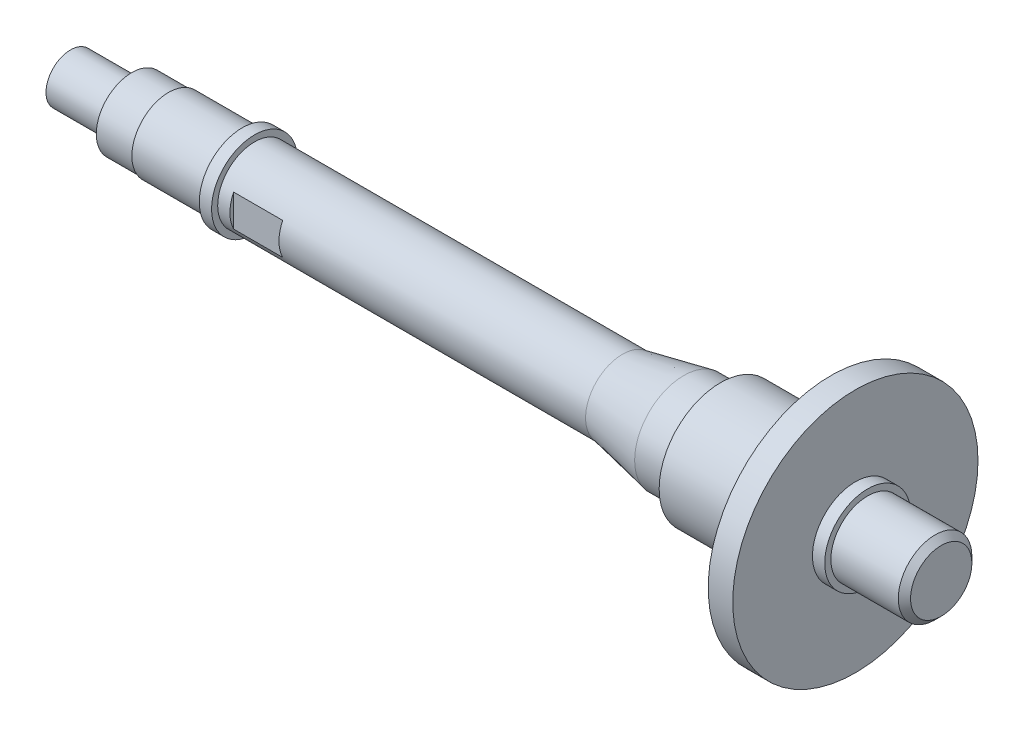
ISO-10303-21;
HEADER;
FILE_DESCRIPTION(('STEP AP214'),'2;1');
FILE_NAME('part.step','',(''),(''),'','','');
FILE_SCHEMA(('AUTOMOTIVE_DESIGN { 1 0 10303 214 1 1 1 1 }'));
ENDSEC;
DATA;
#1=APPLICATION_CONTEXT('core data for automotive mechanical design processes');
#2=APPLICATION_PROTOCOL_DEFINITION('international standard','automotive_design',2000,#1);
#3=PRODUCT_CONTEXT('',#1,'mechanical');
#4=PRODUCT('Part','Part','',(#3));
#5=PRODUCT_RELATED_PRODUCT_CATEGORY('part','',(#4));
#6=PRODUCT_DEFINITION_FORMATION('','',#4);
#7=PRODUCT_DEFINITION_CONTEXT('part definition',#1,'design');
#8=PRODUCT_DEFINITION('design','',#6,#7);
#9=PRODUCT_DEFINITION_SHAPE('','',#8);
#10=(LENGTH_UNIT() NAMED_UNIT(*) SI_UNIT(.MILLI.,.METRE.));
#11=(NAMED_UNIT(*) PLANE_ANGLE_UNIT() SI_UNIT($,.RADIAN.));
#12=(NAMED_UNIT(*) SI_UNIT($,.STERADIAN.) SOLID_ANGLE_UNIT());
#13=UNCERTAINTY_MEASURE_WITH_UNIT(LENGTH_MEASURE(1.E-05),#10,'distance_accuracy_value','');
#14=(GEOMETRIC_REPRESENTATION_CONTEXT(3) GLOBAL_UNCERTAINTY_ASSIGNED_CONTEXT((#13)) GLOBAL_UNIT_ASSIGNED_CONTEXT((#10,
#11,#12)) REPRESENTATION_CONTEXT('',''));
#15=CARTESIAN_POINT('',(0.,0.,0.));
#16=DIRECTION('',(0.,0.,1.));
#17=DIRECTION('',(1.,0.,0.));
#18=AXIS2_PLACEMENT_3D('',#15,#16,#17);
#19=CARTESIAN_POINT('',(-57.,0.,0.));
#20=DIRECTION('',(1.,0.,0.));
#21=DIRECTION('',(0.,0.,-1.));
#22=AXIS2_PLACEMENT_3D('',#19,#20,#21);
#23=CYLINDRICAL_SURFACE('',#22,3.);
#24=CARTESIAN_POINT('',(-48.,0.,0.));
#25=DIRECTION('',(-1.,0.,0.));
#26=DIRECTION('',(0.,0.,1.));
#27=AXIS2_PLACEMENT_3D('',#24,#25,#26);
#28=CIRCLE('',#27,3.);
#29=CARTESIAN_POINT('',(-48.,0.,3.));
#30=VERTEX_POINT('',#29);
#31=EDGE_CURVE('E225',#30,#30,#28,.T.);
#32=ORIENTED_EDGE('',*,*,#31,.T.);
#33=EDGE_LOOP('',(#32));
#34=FACE_BOUND('',#33,.T.);
#35=CARTESIAN_POINT('',(-54.,0.,0.));
#36=DIRECTION('',(-1.,0.,0.));
#37=DIRECTION('',(0.,0.,1.));
#38=AXIS2_PLACEMENT_3D('',#35,#36,#37);
#39=CIRCLE('',#38,3.);
#40=CARTESIAN_POINT('',(-54.,0.,3.));
#41=VERTEX_POINT('',#40);
#42=EDGE_CURVE('E259',#41,#41,#39,.T.);
#43=ORIENTED_EDGE('',*,*,#42,.F.);
#44=EDGE_LOOP('',(#43));
#45=FACE_BOUND('',#44,.T.);
#46=ADVANCED_FACE('F120',(#34,#45),#23,.T.);
#47=CARTESIAN_POINT('',(-3.,0.,0.));
#48=DIRECTION('',(-1.,0.,0.));
#49=DIRECTION('',(0.,0.,1.));
#50=AXIS2_PLACEMENT_3D('',#47,#48,#49);
#51=PLANE('',#50);
#52=CARTESIAN_POINT('',(-3.,0.,0.));
#53=DIRECTION('',(-1.,0.,0.));
#54=DIRECTION('',(0.,0.,1.));
#55=AXIS2_PLACEMENT_3D('',#52,#53,#54);
#56=CIRCLE('',#55,4.5);
#57=CARTESIAN_POINT('',(-3.,0.,4.5));
#58=VERTEX_POINT('',#57);
#59=EDGE_CURVE('E244',#58,#58,#56,.T.);
#60=ORIENTED_EDGE('',*,*,#59,.T.);
#61=EDGE_LOOP('',(#60));
#62=FACE_BOUND('',#61,.T.);
#63=CARTESIAN_POINT('',(-3.,0.,0.));
#64=DIRECTION('',(-1.,0.,0.));
#65=DIRECTION('',(0.,0.,1.));
#66=AXIS2_PLACEMENT_3D('',#63,#64,#65);
#67=CIRCLE('',#66,5.);
#68=CARTESIAN_POINT('',(-3.,0.,5.));
#69=VERTEX_POINT('',#68);
#70=EDGE_CURVE('E248',#69,#69,#67,.T.);
#71=ORIENTED_EDGE('',*,*,#70,.F.);
#72=EDGE_LOOP('',(#71));
#73=FACE_BOUND('',#72,.T.);
#74=ADVANCED_FACE('F279',(#62,#73),#51,.F.);
#75=CARTESIAN_POINT('',(-2.,0.,0.));
#76=DIRECTION('',(-1.,0.,0.));
#77=DIRECTION('',(0.,0.,1.));
#78=AXIS2_PLACEMENT_3D('',#75,#76,#77);
#79=PLANE('',#78);
#80=CARTESIAN_POINT('',(-2.,0.,0.));
#81=DIRECTION('',(-1.,0.,0.));
#82=DIRECTION('',(0.,0.,1.));
#83=AXIS2_PLACEMENT_3D('',#80,#81,#82);
#84=CIRCLE('',#83,6.);
#85=CARTESIAN_POINT('',(-2.,0.,6.));
#86=VERTEX_POINT('',#85);
#87=EDGE_CURVE('E173',#86,#86,#84,.T.);
#88=ORIENTED_EDGE('',*,*,#87,.T.);
#89=EDGE_LOOP('',(#88));
#90=FACE_BOUND('',#89,.T.);
#91=CARTESIAN_POINT('',(-2.,0.,0.));
#92=DIRECTION('',(-1.,0.,0.));
#93=DIRECTION('',(0.,0.,1.));
#94=AXIS2_PLACEMENT_3D('',#91,#92,#93);
#95=CIRCLE('',#94,4.5);
#96=CARTESIAN_POINT('',(-2.,0.,4.5));
#97=VERTEX_POINT('',#96);
#98=EDGE_CURVE('E245',#97,#97,#95,.T.);
#99=ORIENTED_EDGE('',*,*,#98,.F.);
#100=EDGE_LOOP('',(#99));
#101=FACE_BOUND('',#100,.T.);
#102=ADVANCED_FACE('F285',(#90,#101),#79,.T.);
#103=CARTESIAN_POINT('',(-3.,0.,0.));
#104=DIRECTION('',(1.,0.,0.));
#105=DIRECTION('',(0.,0.,-1.));
#106=AXIS2_PLACEMENT_3D('',#103,#104,#105);
#107=CYLINDRICAL_SURFACE('',#106,4.5);
#108=ORIENTED_EDGE('',*,*,#59,.F.);
#109=EDGE_LOOP('',(#108));
#110=FACE_BOUND('',#109,.T.);
#111=ORIENTED_EDGE('',*,*,#98,.T.);
#112=EDGE_LOOP('',(#111));
#113=FACE_BOUND('',#112,.T.);
#114=ADVANCED_FACE('F313',(#110,#113),#107,.T.);
#115=CARTESIAN_POINT('',(9.,0.,0.));
#116=DIRECTION('',(1.,0.,0.));
#117=DIRECTION('',(0.,0.,-1.));
#118=AXIS2_PLACEMENT_3D('',#115,#116,#117);
#119=PLANE('',#118);
#120=CARTESIAN_POINT('',(9.,0.,0.));
#121=DIRECTION('',(1.,0.,0.));
#122=DIRECTION('',(0.,0.,-1.));
#123=AXIS2_PLACEMENT_3D('',#120,#121,#122);
#124=CIRCLE('',#123,2.5);
#125=CARTESIAN_POINT('',(9.,0.,-2.5));
#126=VERTEX_POINT('',#125);
#127=EDGE_CURVE('E191',#126,#126,#124,.T.);
#128=ORIENTED_EDGE('',*,*,#127,.T.);
#129=EDGE_LOOP('',(#128));
#130=FACE_BOUND('',#129,.T.);
#131=ADVANCED_FACE('F310',(#130),#119,.T.);
#132=CARTESIAN_POINT('',(9.,0.,0.));
#133=DIRECTION('',(-1.,0.,0.));
#134=DIRECTION('',(0.,0.,1.));
#135=AXIS2_PLACEMENT_3D('',#132,#133,#134);
#136=CONICAL_SURFACE('',#135,2.5,0.785398163397451);
#137=CARTESIAN_POINT('',(8.5,0.,0.));
#138=DIRECTION('',(1.,0.,0.));
#139=DIRECTION('',(0.,0.,-1.));
#140=AXIS2_PLACEMENT_3D('',#137,#138,#139);
#141=CIRCLE('',#140,3.);
#142=CARTESIAN_POINT('',(8.5,0.,-3.));
#143=VERTEX_POINT('',#142);
#144=EDGE_CURVE('E188',#143,#143,#141,.F.);
#145=ORIENTED_EDGE('',*,*,#144,.F.);
#146=EDGE_LOOP('',(#145));
#147=FACE_BOUND('',#146,.T.);
#148=ORIENTED_EDGE('',*,*,#127,.F.);
#149=EDGE_LOOP('',(#148));
#150=FACE_BOUND('',#149,.T.);
#151=ADVANCED_FACE('F122',(#147,#150),#136,.T.);
#152=CARTESIAN_POINT('',(9.,0.,0.));
#153=DIRECTION('',(-1.,0.,0.));
#154=DIRECTION('',(0.,0.,1.));
#155=AXIS2_PLACEMENT_3D('',#152,#153,#154);
#156=CYLINDRICAL_SURFACE('',#155,3.);
#157=ORIENTED_EDGE('',*,*,#144,.T.);
#158=EDGE_LOOP('',(#157));
#159=FACE_BOUND('',#158,.T.);
#160=CARTESIAN_POINT('',(3.,0.,0.));
#161=DIRECTION('',(1.,0.,0.));
#162=DIRECTION('',(0.,0.,-1.));
#163=AXIS2_PLACEMENT_3D('',#160,#161,#162);
#164=CIRCLE('',#163,3.);
#165=CARTESIAN_POINT('',(3.,0.,-3.));
#166=VERTEX_POINT('',#165);
#167=EDGE_CURVE('E213',#166,#166,#164,.T.);
#168=ORIENTED_EDGE('',*,*,#167,.T.);
#169=EDGE_LOOP('',(#168));
#170=FACE_BOUND('',#169,.T.);
#171=ADVANCED_FACE('F315',(#159,#170),#156,.T.);
#172=CARTESIAN_POINT('',(3.,0.,0.));
#173=DIRECTION('',(1.,0.,0.));
#174=DIRECTION('',(0.,0.,-1.));
#175=AXIS2_PLACEMENT_3D('',#172,#173,#174);
#176=PLANE('',#175);
#177=CARTESIAN_POINT('',(3.,0.,0.));
#178=DIRECTION('',(1.,0.,0.));
#179=DIRECTION('',(0.,0.,-1.));
#180=AXIS2_PLACEMENT_3D('',#177,#178,#179);
#181=CIRCLE('',#180,3.5);
#182=CARTESIAN_POINT('',(3.,0.,-3.5));
#183=VERTEX_POINT('',#182);
#184=EDGE_CURVE('E201',#183,#183,#181,.T.);
#185=ORIENTED_EDGE('',*,*,#184,.T.);
#186=EDGE_LOOP('',(#185));
#187=FACE_BOUND('',#186,.T.);
#188=ORIENTED_EDGE('',*,*,#167,.F.);
#189=EDGE_LOOP('',(#188));
#190=FACE_BOUND('',#189,.T.);
#191=ADVANCED_FACE('F318',(#187,#190),#176,.T.);
#192=CARTESIAN_POINT('',(3.,0.,0.));
#193=DIRECTION('',(-1.,0.,0.));
#194=DIRECTION('',(0.,0.,1.));
#195=AXIS2_PLACEMENT_3D('',#192,#193,#194);
#196=CYLINDRICAL_SURFACE('',#195,3.5);
#197=ORIENTED_EDGE('',*,*,#184,.F.);
#198=EDGE_LOOP('',(#197));
#199=FACE_BOUND('',#198,.T.);
#200=CARTESIAN_POINT('',(2.,0.,0.));
#201=DIRECTION('',(1.,0.,0.));
#202=DIRECTION('',(0.,0.,-1.));
#203=AXIS2_PLACEMENT_3D('',#200,#201,#202);
#204=CIRCLE('',#203,3.5);
#205=CARTESIAN_POINT('',(2.,0.,-3.5));
#206=VERTEX_POINT('',#205);
#207=EDGE_CURVE('E204',#206,#206,#204,.T.);
#208=ORIENTED_EDGE('',*,*,#207,.T.);
#209=EDGE_LOOP('',(#208));
#210=FACE_BOUND('',#209,.T.);
#211=ADVANCED_FACE('F336',(#199,#210),#196,.T.);
#212=CARTESIAN_POINT('',(2.,0.,0.));
#213=DIRECTION('',(1.,0.,0.));
#214=DIRECTION('',(0.,0.,-1.));
#215=AXIS2_PLACEMENT_3D('',#212,#213,#214);
#216=PLANE('',#215);
#217=CARTESIAN_POINT('',(2.,0.,0.));
#218=DIRECTION('',(1.,0.,0.));
#219=DIRECTION('',(0.,0.,-1.));
#220=AXIS2_PLACEMENT_3D('',#217,#218,#219);
#221=CIRCLE('',#220,10.);
#222=CARTESIAN_POINT('',(2.,0.,-10.));
#223=VERTEX_POINT('',#222);
#224=EDGE_CURVE('E197',#223,#223,#221,.T.);
#225=ORIENTED_EDGE('',*,*,#224,.T.);
#226=EDGE_LOOP('',(#225));
#227=FACE_BOUND('',#226,.T.);
#228=ORIENTED_EDGE('',*,*,#207,.F.);
#229=EDGE_LOOP('',(#228));
#230=FACE_BOUND('',#229,.T.);
#231=ADVANCED_FACE('F340',(#227,#230),#216,.T.);
#232=CARTESIAN_POINT('',(2.,0.,0.));
#233=DIRECTION('',(-1.,0.,0.));
#234=DIRECTION('',(0.,0.,1.));
#235=AXIS2_PLACEMENT_3D('',#232,#233,#234);
#236=CYLINDRICAL_SURFACE('',#235,10.);
#237=ORIENTED_EDGE('',*,*,#224,.F.);
#238=EDGE_LOOP('',(#237));
#239=FACE_BOUND('',#238,.T.);
#240=CARTESIAN_POINT('',(0.,0.,0.));
#241=DIRECTION('',(1.,0.,0.));
#242=DIRECTION('',(0.,0.,-1.));
#243=AXIS2_PLACEMENT_3D('',#240,#241,#242);
#244=CIRCLE('',#243,10.);
#245=CARTESIAN_POINT('',(0.,0.,-10.));
#246=VERTEX_POINT('',#245);
#247=EDGE_CURVE('E198',#246,#246,#244,.T.);
#248=ORIENTED_EDGE('',*,*,#247,.T.);
#249=EDGE_LOOP('',(#248));
#250=FACE_BOUND('',#249,.T.);
#251=ADVANCED_FACE('F344',(#239,#250),#236,.T.);
#252=CARTESIAN_POINT('',(0.,0.,0.));
#253=DIRECTION('',(1.,0.,0.));
#254=DIRECTION('',(0.,0.,-1.));
#255=AXIS2_PLACEMENT_3D('',#252,#253,#254);
#256=PLANE('',#255);
#257=ORIENTED_EDGE('',*,*,#247,.F.);
#258=EDGE_LOOP('',(#257));
#259=FACE_BOUND('',#258,.T.);
#260=CARTESIAN_POINT('',(0.,0.,0.));
#261=DIRECTION('',(1.,0.,0.));
#262=DIRECTION('',(0.,0.,-1.));
#263=AXIS2_PLACEMENT_3D('',#260,#261,#262);
#264=CIRCLE('',#263,6.);
#265=CARTESIAN_POINT('',(0.,0.,-6.));
#266=VERTEX_POINT('',#265);
#267=EDGE_CURVE('E194',#266,#266,#264,.F.);
#268=ORIENTED_EDGE('',*,*,#267,.F.);
#269=EDGE_LOOP('',(#268));
#270=FACE_BOUND('',#269,.T.);
#271=ADVANCED_FACE('F332',(#259,#270),#256,.F.);
#272=CARTESIAN_POINT('',(-9.,0.,0.));
#273=DIRECTION('',(1.,0.,0.));
#274=DIRECTION('',(0.,0.,-1.));
#275=AXIS2_PLACEMENT_3D('',#272,#273,#274);
#276=CYLINDRICAL_SURFACE('',#275,6.);
#277=ORIENTED_EDGE('',*,*,#267,.T.);
#278=EDGE_LOOP('',(#277));
#279=FACE_BOUND('',#278,.T.);
#280=ORIENTED_EDGE('',*,*,#87,.F.);
#281=EDGE_LOOP('',(#280));
#282=FACE_BOUND('',#281,.T.);
#283=ADVANCED_FACE('F329',(#279,#282),#276,.T.);
#284=CARTESIAN_POINT('',(-3.,0.,0.));
#285=DIRECTION('',(-1.,0.,0.));
#286=DIRECTION('',(0.,0.,1.));
#287=AXIS2_PLACEMENT_3D('',#284,#285,#286);
#288=CYLINDRICAL_SURFACE('',#287,5.);
#289=ORIENTED_EDGE('',*,*,#70,.T.);
#290=EDGE_LOOP('',(#289));
#291=FACE_BOUND('',#290,.T.);
#292=CARTESIAN_POINT('',(-9.,0.,0.));
#293=DIRECTION('',(-1.,0.,0.));
#294=DIRECTION('',(0.,0.,1.));
#295=AXIS2_PLACEMENT_3D('',#292,#293,#294);
#296=CIRCLE('',#295,5.);
#297=CARTESIAN_POINT('',(-9.,0.,5.));
#298=VERTEX_POINT('',#297);
#299=EDGE_CURVE('E251',#298,#298,#296,.T.);
#300=ORIENTED_EDGE('',*,*,#299,.F.);
#301=EDGE_LOOP('',(#300));
#302=FACE_BOUND('',#301,.T.);
#303=ADVANCED_FACE('F324',(#291,#302),#288,.T.);
#304=CARTESIAN_POINT('',(-12.,0.,0.));
#305=DIRECTION('',(1.,0.,0.));
#306=DIRECTION('',(0.,0.,-1.));
#307=AXIS2_PLACEMENT_3D('',#304,#305,#306);
#308=CYLINDRICAL_SURFACE('',#307,4.);
#309=CARTESIAN_POINT('',(-12.,0.,0.));
#310=DIRECTION('',(-1.,0.,0.));
#311=DIRECTION('',(0.,0.,1.));
#312=AXIS2_PLACEMENT_3D('',#309,#310,#311);
#313=CIRCLE('',#312,4.);
#314=CARTESIAN_POINT('',(-12.,0.,4.));
#315=VERTEX_POINT('',#314);
#316=EDGE_CURVE('E207',#315,#315,#313,.T.);
#317=ORIENTED_EDGE('',*,*,#316,.F.);
#318=EDGE_LOOP('',(#317));
#319=FACE_BOUND('',#318,.T.);
#320=CARTESIAN_POINT('',(-9.,0.,0.));
#321=DIRECTION('',(-1.,0.,0.));
#322=DIRECTION('',(0.,0.,1.));
#323=AXIS2_PLACEMENT_3D('',#320,#321,#322);
#324=CIRCLE('',#323,4.);
#325=CARTESIAN_POINT('',(-9.,0.,4.));
#326=VERTEX_POINT('',#325);
#327=EDGE_CURVE('E210',#326,#326,#324,.T.);
#328=ORIENTED_EDGE('',*,*,#327,.T.);
#329=EDGE_LOOP('',(#328));
#330=FACE_BOUND('',#329,.T.);
#331=ADVANCED_FACE('F320',(#319,#330),#308,.T.);
#332=CARTESIAN_POINT('',(-9.,0.,0.));
#333=DIRECTION('',(-1.,0.,0.));
#334=DIRECTION('',(0.,0.,1.));
#335=AXIS2_PLACEMENT_3D('',#332,#333,#334);
#336=PLANE('',#335);
#337=ORIENTED_EDGE('',*,*,#327,.F.);
#338=EDGE_LOOP('',(#337));
#339=FACE_BOUND('',#338,.T.);
#340=ORIENTED_EDGE('',*,*,#299,.T.);
#341=EDGE_LOOP('',(#340));
#342=FACE_BOUND('',#341,.T.);
#343=ADVANCED_FACE('F323',(#339,#342),#336,.T.);
#344=CARTESIAN_POINT('',(-12.,0.,0.));
#345=DIRECTION('',(1.,0.,0.));
#346=DIRECTION('',(0.,0.,-1.));
#347=AXIS2_PLACEMENT_3D('',#344,#345,#346);
#348=CONICAL_SURFACE('',#347,4.,0.197395559849881);
#349=CARTESIAN_POINT('',(-17.,0.,0.));
#350=DIRECTION('',(1.,0.,0.));
#351=DIRECTION('',(0.,0.,-1.));
#352=AXIS2_PLACEMENT_3D('',#349,#350,#351);
#353=CIRCLE('',#352,3.);
#354=CARTESIAN_POINT('',(-17.,0.,-3.));
#355=VERTEX_POINT('',#354);
#356=EDGE_CURVE('E254',#355,#355,#353,.T.);
#357=ORIENTED_EDGE('',*,*,#356,.T.);
#358=EDGE_LOOP('',(#357));
#359=FACE_BOUND('',#358,.T.);
#360=ORIENTED_EDGE('',*,*,#316,.T.);
#361=EDGE_LOOP('',(#360));
#362=FACE_BOUND('',#361,.T.);
#363=ADVANCED_FACE('F296',(#359,#362),#348,.T.);
#364=CARTESIAN_POINT('',(-48.,0.,0.));
#365=DIRECTION('',(-1.,0.,0.));
#366=DIRECTION('',(0.,0.,1.));
#367=AXIS2_PLACEMENT_3D('',#364,#365,#366);
#368=PLANE('',#367);
#369=CARTESIAN_POINT('',(-48.,0.,0.));
#370=DIRECTION('',(-1.,0.,0.));
#371=DIRECTION('',(0.,0.,1.));
#372=AXIS2_PLACEMENT_3D('',#369,#370,#371);
#373=CIRCLE('',#372,3.5);
#374=CARTESIAN_POINT('',(-48.,0.,3.5));
#375=VERTEX_POINT('',#374);
#376=EDGE_CURVE('E221',#375,#375,#373,.T.);
#377=ORIENTED_EDGE('',*,*,#376,.T.);
#378=EDGE_LOOP('',(#377));
#379=FACE_BOUND('',#378,.T.);
#380=ORIENTED_EDGE('',*,*,#31,.F.);
#381=EDGE_LOOP('',(#380));
#382=FACE_BOUND('',#381,.T.);
#383=ADVANCED_FACE('F292',(#379,#382),#368,.T.);
#384=CARTESIAN_POINT('',(-48.,0.,0.));
#385=DIRECTION('',(1.,0.,0.));
#386=DIRECTION('',(0.,0.,-1.));
#387=AXIS2_PLACEMENT_3D('',#384,#385,#386);
#388=CYLINDRICAL_SURFACE('',#387,3.5);
#389=ORIENTED_EDGE('',*,*,#376,.F.);
#390=EDGE_LOOP('',(#389));
#391=FACE_BOUND('',#390,.T.);
#392=CARTESIAN_POINT('',(-47.,0.,0.));
#393=DIRECTION('',(-1.,0.,0.));
#394=DIRECTION('',(0.,0.,1.));
#395=AXIS2_PLACEMENT_3D('',#392,#393,#394);
#396=CIRCLE('',#395,3.5);
#397=CARTESIAN_POINT('',(-47.,0.,3.5));
#398=VERTEX_POINT('',#397);
#399=EDGE_CURVE('E222',#398,#398,#396,.T.);
#400=ORIENTED_EDGE('',*,*,#399,.T.);
#401=EDGE_LOOP('',(#400));
#402=FACE_BOUND('',#401,.T.);
#403=ADVANCED_FACE('F295',(#391,#402),#388,.T.);
#404=CARTESIAN_POINT('',(-47.,0.,0.));
#405=DIRECTION('',(-1.,0.,0.));
#406=DIRECTION('',(0.,0.,1.));
#407=AXIS2_PLACEMENT_3D('',#404,#405,#406);
#408=PLANE('',#407);
#409=ORIENTED_EDGE('',*,*,#399,.F.);
#410=EDGE_LOOP('',(#409));
#411=FACE_BOUND('',#410,.T.);
#412=CARTESIAN_POINT('',(-47.,0.,0.));
#413=DIRECTION('',(-1.,0.,0.));
#414=DIRECTION('',(0.,0.,1.));
#415=AXIS2_PLACEMENT_3D('',#412,#413,#414);
#416=CIRCLE('',#415,3.);
#417=CARTESIAN_POINT('',(-47.,0.,3.));
#418=VERTEX_POINT('',#417);
#419=EDGE_CURVE('E218',#418,#418,#416,.T.);
#420=ORIENTED_EDGE('',*,*,#419,.T.);
#421=EDGE_LOOP('',(#420));
#422=FACE_BOUND('',#421,.T.);
#423=ADVANCED_FACE('F298',(#411,#422),#408,.F.);
#424=CARTESIAN_POINT('',(-46.,-5.,-3.));
#425=DIRECTION('',(-1.,0.,0.));
#426=DIRECTION('',(0.,0.,1.));
#427=AXIS2_PLACEMENT_3D('',#424,#425,#426);
#428=PLANE('',#427);
#429=DIRECTION('',(0.,1.,0.));
#430=VECTOR('',#429,1.);
#431=CARTESIAN_POINT('',(-46.,-5.,-2.7));
#432=LINE('',#431,#430);
#433=CARTESIAN_POINT('',(-46.,-1.3076696830622,-2.7));
#434=VERTEX_POINT('',#433);
#435=CARTESIAN_POINT('',(-46.,1.3076696830622,-2.7));
#436=VERTEX_POINT('',#435);
#437=EDGE_CURVE('E237',#434,#436,#432,.T.);
#438=ORIENTED_EDGE('',*,*,#437,.F.);
#439=CARTESIAN_POINT('',(-46.,0.,0.));
#440=DIRECTION('',(-1.,0.,0.));
#441=DIRECTION('',(0.,0.,1.));
#442=AXIS2_PLACEMENT_3D('',#439,#440,#441);
#443=CIRCLE('',#442,3.);
#444=EDGE_CURVE('E141',#436,#434,#443,.T.);
#445=ORIENTED_EDGE('',*,*,#444,.F.);
#446=EDGE_LOOP('',(#438,#445));
#447=FACE_BOUND('',#446,.T.);
#448=ADVANCED_FACE('F301',(#447),#428,.F.);
#449=CARTESIAN_POINT('',(-42.,-5.,-3.));
#450=DIRECTION('',(1.,0.,0.));
#451=DIRECTION('',(0.,0.,-1.));
#452=AXIS2_PLACEMENT_3D('',#449,#450,#451);
#453=PLANE('',#452);
#454=CARTESIAN_POINT('',(-42.,0.,0.));
#455=DIRECTION('',(1.,0.,0.));
#456=DIRECTION('',(0.,0.,-1.));
#457=AXIS2_PLACEMENT_3D('',#454,#455,#456);
#458=CIRCLE('',#457,3.);
#459=CARTESIAN_POINT('',(-42.,-1.3076696830622,-2.7));
#460=VERTEX_POINT('',#459);
#461=CARTESIAN_POINT('',(-42.,1.3076696830622,-2.7));
#462=VERTEX_POINT('',#461);
#463=EDGE_CURVE('E182',#460,#462,#458,.T.);
#464=ORIENTED_EDGE('',*,*,#463,.F.);
#465=DIRECTION('',(0.,1.,0.));
#466=VECTOR('',#465,1.);
#467=CARTESIAN_POINT('',(-42.,-5.,-2.7));
#468=LINE('',#467,#466);
#469=EDGE_CURVE('E234',#460,#462,#468,.T.);
#470=ORIENTED_EDGE('',*,*,#469,.T.);
#471=EDGE_LOOP('',(#464,#470));
#472=FACE_BOUND('',#471,.T.);
#473=ADVANCED_FACE('F382',(#472),#453,.F.);
#474=CARTESIAN_POINT('',(-46.,-5.,-2.7));
#475=DIRECTION('',(0.,0.,1.));
#476=DIRECTION('',(1.,0.,0.));
#477=AXIS2_PLACEMENT_3D('',#474,#475,#476);
#478=PLANE('',#477);
#479=ORIENTED_EDGE('',*,*,#437,.T.);
#480=DIRECTION('',(1.,0.,0.));
#481=VECTOR('',#480,1.);
#482=CARTESIAN_POINT('',(-47.,1.3076696830622,-2.7));
#483=LINE('',#482,#481);
#484=EDGE_CURVE('E185',#462,#436,#483,.F.);
#485=ORIENTED_EDGE('',*,*,#484,.F.);
#486=ORIENTED_EDGE('',*,*,#469,.F.);
#487=DIRECTION('',(1.,0.,0.));
#488=VECTOR('',#487,1.);
#489=CARTESIAN_POINT('',(-47.,-1.3076696830622,-2.7));
#490=LINE('',#489,#488);
#491=EDGE_CURVE('E165',#434,#460,#490,.T.);
#492=ORIENTED_EDGE('',*,*,#491,.F.);
#493=EDGE_LOOP('',(#479,#485,#486,#492));
#494=FACE_BOUND('',#493,.T.);
#495=ADVANCED_FACE('F381',(#494),#478,.F.);
#496=CARTESIAN_POINT('',(-42.,-5.,3.));
#497=DIRECTION('',(1.,0.,0.));
#498=DIRECTION('',(0.,0.,-1.));
#499=AXIS2_PLACEMENT_3D('',#496,#497,#498);
#500=PLANE('',#499);
#501=DIRECTION('',(0.,1.,0.));
#502=VECTOR('',#501,1.);
#503=CARTESIAN_POINT('',(-42.,-5.,2.7));
#504=LINE('',#503,#502);
#505=CARTESIAN_POINT('',(-42.,-1.3076696830622,2.7));
#506=VERTEX_POINT('',#505);
#507=CARTESIAN_POINT('',(-42.,1.3076696830622,2.7));
#508=VERTEX_POINT('',#507);
#509=EDGE_CURVE('E134',#506,#508,#504,.T.);
#510=ORIENTED_EDGE('',*,*,#509,.F.);
#511=CARTESIAN_POINT('',(-42.,0.,0.));
#512=DIRECTION('',(1.,0.,0.));
#513=DIRECTION('',(0.,0.,-1.));
#514=AXIS2_PLACEMENT_3D('',#511,#512,#513);
#515=CIRCLE('',#514,3.);
#516=EDGE_CURVE('E159',#508,#506,#515,.T.);
#517=ORIENTED_EDGE('',*,*,#516,.F.);
#518=EDGE_LOOP('',(#510,#517));
#519=FACE_BOUND('',#518,.T.);
#520=ADVANCED_FACE('F160',(#519),#500,.F.);
#521=CARTESIAN_POINT('',(-46.,-5.,2.7));
#522=DIRECTION('',(0.,0.,-1.));
#523=DIRECTION('',(-1.,0.,0.));
#524=AXIS2_PLACEMENT_3D('',#521,#522,#523);
#525=PLANE('',#524);
#526=DIRECTION('',(0.,1.,0.));
#527=VECTOR('',#526,1.);
#528=CARTESIAN_POINT('',(-46.,-5.,2.7));
#529=LINE('',#528,#527);
#530=CARTESIAN_POINT('',(-46.,-1.3076696830622,2.7));
#531=VERTEX_POINT('',#530);
#532=CARTESIAN_POINT('',(-46.,1.3076696830622,2.7));
#533=VERTEX_POINT('',#532);
#534=EDGE_CURVE('E172',#531,#533,#529,.T.);
#535=ORIENTED_EDGE('',*,*,#534,.F.);
#536=DIRECTION('',(1.,0.,0.));
#537=VECTOR('',#536,1.);
#538=CARTESIAN_POINT('',(-47.,-1.3076696830622,2.7));
#539=LINE('',#538,#537);
#540=EDGE_CURVE('E164',#506,#531,#539,.F.);
#541=ORIENTED_EDGE('',*,*,#540,.F.);
#542=ORIENTED_EDGE('',*,*,#509,.T.);
#543=DIRECTION('',(1.,0.,0.));
#544=VECTOR('',#543,1.);
#545=CARTESIAN_POINT('',(-47.,1.3076696830622,2.7));
#546=LINE('',#545,#544);
#547=EDGE_CURVE('E128',#533,#508,#546,.T.);
#548=ORIENTED_EDGE('',*,*,#547,.F.);
#549=EDGE_LOOP('',(#535,#541,#542,#548));
#550=FACE_BOUND('',#549,.T.);
#551=ADVANCED_FACE('F170',(#550),#525,.F.);
#552=CARTESIAN_POINT('',(-46.,-5.,3.));
#553=DIRECTION('',(-1.,0.,0.));
#554=DIRECTION('',(0.,0.,1.));
#555=AXIS2_PLACEMENT_3D('',#552,#553,#554);
#556=PLANE('',#555);
#557=CARTESIAN_POINT('',(-46.,0.,0.));
#558=DIRECTION('',(-1.,0.,0.));
#559=DIRECTION('',(0.,0.,1.));
#560=AXIS2_PLACEMENT_3D('',#557,#558,#559);
#561=CIRCLE('',#560,3.);
#562=EDGE_CURVE('E12',#531,#533,#561,.T.);
#563=ORIENTED_EDGE('',*,*,#562,.F.);
#564=ORIENTED_EDGE('',*,*,#534,.T.);
#565=EDGE_LOOP('',(#563,#564));
#566=FACE_BOUND('',#565,.T.);
#567=ADVANCED_FACE('F308',(#566),#556,.F.);
#568=CARTESIAN_POINT('',(-47.,0.,0.));
#569=DIRECTION('',(1.,0.,0.));
#570=DIRECTION('',(0.,0.,-1.));
#571=AXIS2_PLACEMENT_3D('',#568,#569,#570);
#572=CYLINDRICAL_SURFACE('',#571,3.);
#573=ORIENTED_EDGE('',*,*,#356,.F.);
#574=EDGE_LOOP('',(#573));
#575=FACE_BOUND('',#574,.T.);
#576=ORIENTED_EDGE('',*,*,#562,.T.);
#577=ORIENTED_EDGE('',*,*,#547,.T.);
#578=ORIENTED_EDGE('',*,*,#516,.T.);
#579=ORIENTED_EDGE('',*,*,#540,.T.);
#580=EDGE_LOOP('',(#576,#577,#578,#579));
#581=FACE_BOUND('',#580,.T.);
#582=ORIENTED_EDGE('',*,*,#491,.T.);
#583=ORIENTED_EDGE('',*,*,#463,.T.);
#584=ORIENTED_EDGE('',*,*,#484,.T.);
#585=ORIENTED_EDGE('',*,*,#444,.T.);
#586=EDGE_LOOP('',(#582,#583,#584,#585));
#587=FACE_BOUND('',#586,.T.);
#588=ORIENTED_EDGE('',*,*,#419,.F.);
#589=EDGE_LOOP('',(#588));
#590=FACE_BOUND('',#589,.T.);
#591=ADVANCED_FACE('F175',(#575,#581,#587,#590),#572,.T.);
#592=CARTESIAN_POINT('',(-54.,0.,0.));
#593=DIRECTION('',(-1.,0.,0.));
#594=DIRECTION('',(0.,0.,1.));
#595=AXIS2_PLACEMENT_3D('',#592,#593,#594);
#596=PLANE('',#595);
#597=CARTESIAN_POINT('',(-54.,0.,0.));
#598=DIRECTION('',(-1.,0.,0.));
#599=DIRECTION('',(0.,0.,1.));
#600=AXIS2_PLACEMENT_3D('',#597,#598,#599);
#601=CIRCLE('',#600,2.9);
#602=CARTESIAN_POINT('',(-54.,0.,2.9));
#603=VERTEX_POINT('',#602);
#604=EDGE_CURVE('E262',#603,#603,#601,.T.);
#605=ORIENTED_EDGE('',*,*,#604,.F.);
#606=EDGE_LOOP('',(#605));
#607=FACE_BOUND('',#606,.T.);
#608=ORIENTED_EDGE('',*,*,#42,.T.);
#609=EDGE_LOOP('',(#608));
#610=FACE_BOUND('',#609,.T.);
#611=ADVANCED_FACE('F272',(#607,#610),#596,.T.);
#612=CARTESIAN_POINT('',(-54.,0.,0.));
#613=DIRECTION('',(-1.,0.,0.));
#614=DIRECTION('',(0.,0.,1.));
#615=AXIS2_PLACEMENT_3D('',#612,#613,#614);
#616=CYLINDRICAL_SURFACE('',#615,2.9);
#617=ORIENTED_EDGE('',*,*,#604,.T.);
#618=EDGE_LOOP('',(#617));
#619=FACE_BOUND('',#618,.T.);
#620=CARTESIAN_POINT('',(-57.,0.,0.));
#621=DIRECTION('',(-1.,0.,0.));
#622=DIRECTION('',(0.,0.,1.));
#623=AXIS2_PLACEMENT_3D('',#620,#621,#622);
#624=CIRCLE('',#623,2.9);
#625=CARTESIAN_POINT('',(-57.,0.,2.9));
#626=VERTEX_POINT('',#625);
#627=EDGE_CURVE('E263',#626,#626,#624,.T.);
#628=ORIENTED_EDGE('',*,*,#627,.F.);
#629=EDGE_LOOP('',(#628));
#630=FACE_BOUND('',#629,.T.);
#631=ADVANCED_FACE('F269',(#619,#630),#616,.T.);
#632=CARTESIAN_POINT('',(-62.,0.,0.));
#633=DIRECTION('',(-1.,0.,0.));
#634=DIRECTION('',(0.,0.,1.));
#635=AXIS2_PLACEMENT_3D('',#632,#633,#634);
#636=PLANE('',#635);
#637=CARTESIAN_POINT('',(-62.,0.,0.));
#638=DIRECTION('',(-1.,0.,0.));
#639=DIRECTION('',(0.,0.,1.));
#640=AXIS2_PLACEMENT_3D('',#637,#638,#639);
#641=CIRCLE('',#640,2.);
#642=CARTESIAN_POINT('',(-62.,0.,2.));
#643=VERTEX_POINT('',#642);
#644=EDGE_CURVE('E230',#643,#643,#641,.T.);
#645=ORIENTED_EDGE('',*,*,#644,.T.);
#646=EDGE_LOOP('',(#645));
#647=FACE_BOUND('',#646,.T.);
#648=ADVANCED_FACE('F391',(#647),#636,.T.);
#649=CARTESIAN_POINT('',(-62.,0.,0.));
#650=DIRECTION('',(1.,0.,0.));
#651=DIRECTION('',(0.,0.,-1.));
#652=AXIS2_PLACEMENT_3D('',#649,#650,#651);
#653=CYLINDRICAL_SURFACE('',#652,2.);
#654=ORIENTED_EDGE('',*,*,#644,.F.);
#655=EDGE_LOOP('',(#654));
#656=FACE_BOUND('',#655,.T.);
#657=CARTESIAN_POINT('',(-57.,0.,0.));
#658=DIRECTION('',(-1.,0.,0.));
#659=DIRECTION('',(0.,0.,1.));
#660=AXIS2_PLACEMENT_3D('',#657,#658,#659);
#661=CIRCLE('',#660,2.);
#662=CARTESIAN_POINT('',(-57.,0.,2.));
#663=VERTEX_POINT('',#662);
#664=EDGE_CURVE('E231',#663,#663,#661,.T.);
#665=ORIENTED_EDGE('',*,*,#664,.T.);
#666=EDGE_LOOP('',(#665));
#667=FACE_BOUND('',#666,.T.);
#668=ADVANCED_FACE('F393',(#656,#667),#653,.T.);
#669=CARTESIAN_POINT('',(-57.,0.,0.));
#670=DIRECTION('',(-1.,0.,0.));
#671=DIRECTION('',(0.,0.,1.));
#672=AXIS2_PLACEMENT_3D('',#669,#670,#671);
#673=PLANE('',#672);
#674=ORIENTED_EDGE('',*,*,#664,.F.);
#675=EDGE_LOOP('',(#674));
#676=FACE_BOUND('',#675,.T.);
#677=ORIENTED_EDGE('',*,*,#627,.T.);
#678=EDGE_LOOP('',(#677));
#679=FACE_BOUND('',#678,.T.);
#680=ADVANCED_FACE('F290',(#676,#679),#673,.T.);
#681=CLOSED_SHELL('',(#46,#74,#102,#114,#131,#151,#171,#191,#211,#231,#251,#271,#283,#303,#331,
#343,#363,#383,#403,#423,#448,#473,#495,#520,#551,#567,#591,#611,#631,#648,#668,#680));
#682=MANIFOLD_SOLID_BREP('B2',#681);
#683=ADVANCED_BREP_SHAPE_REPRESENTATION('',(#18,#682),#14);
#684=SHAPE_DEFINITION_REPRESENTATION(#9,#683);
ENDSEC;
END-ISO-10303-21;
